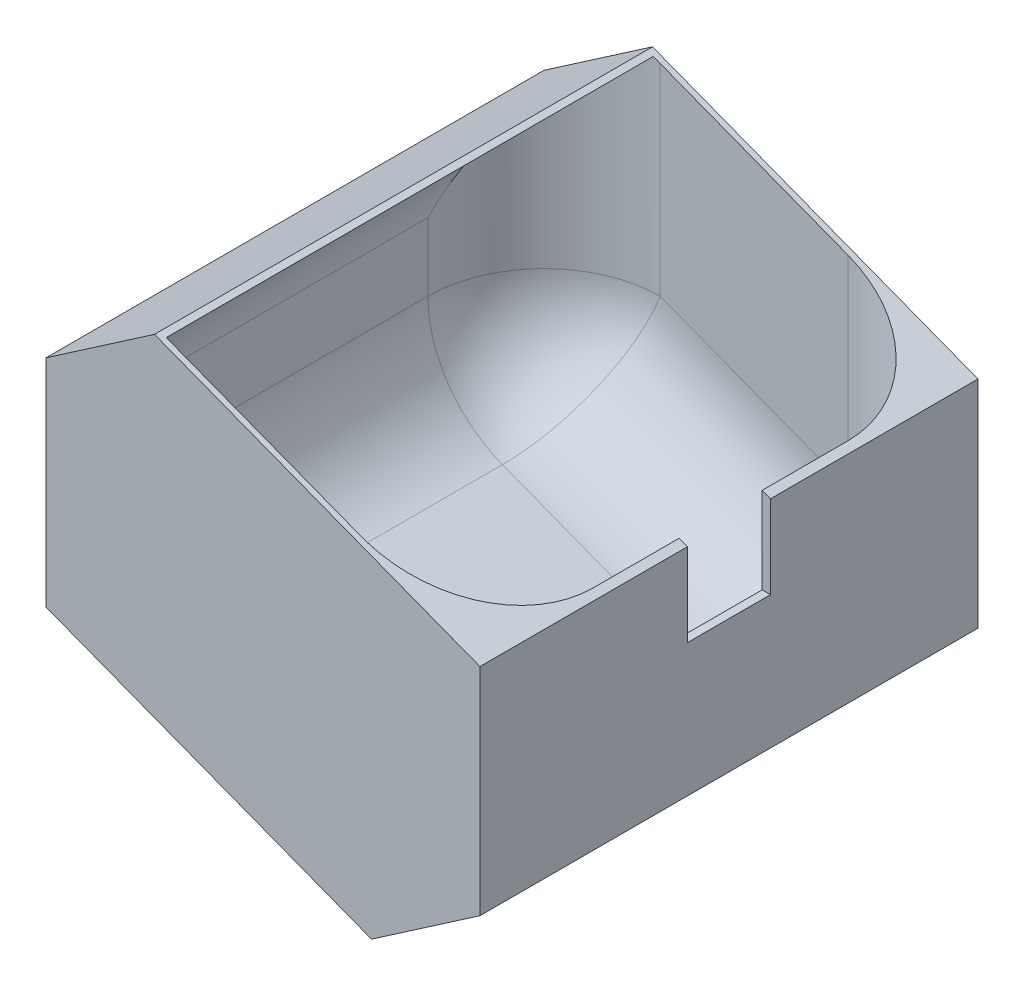
ISO-10303-21;
HEADER;
FILE_DESCRIPTION(('STEP AP214'),'2;1');
FILE_NAME('part.step','',(''),(''),'','','');
FILE_SCHEMA(('AUTOMOTIVE_DESIGN { 1 0 10303 214 1 1 1 1 }'));
ENDSEC;
DATA;
#1=APPLICATION_CONTEXT('core data for automotive mechanical design processes');
#2=APPLICATION_PROTOCOL_DEFINITION('international standard','automotive_design',2000,#1);
#3=PRODUCT_CONTEXT('',#1,'mechanical');
#4=PRODUCT('Part','Part','',(#3));
#5=PRODUCT_RELATED_PRODUCT_CATEGORY('part','',(#4));
#6=PRODUCT_DEFINITION_FORMATION('','',#4);
#7=PRODUCT_DEFINITION_CONTEXT('part definition',#1,'design');
#8=PRODUCT_DEFINITION('design','',#6,#7);
#9=PRODUCT_DEFINITION_SHAPE('','',#8);
#10=(LENGTH_UNIT() NAMED_UNIT(*) SI_UNIT(.MILLI.,.METRE.));
#11=(NAMED_UNIT(*) PLANE_ANGLE_UNIT() SI_UNIT($,.RADIAN.));
#12=(NAMED_UNIT(*) SI_UNIT($,.STERADIAN.) SOLID_ANGLE_UNIT());
#13=UNCERTAINTY_MEASURE_WITH_UNIT(LENGTH_MEASURE(1.E-05),#10,'distance_accuracy_value','');
#14=(GEOMETRIC_REPRESENTATION_CONTEXT(3) GLOBAL_UNCERTAINTY_ASSIGNED_CONTEXT((#13)) GLOBAL_UNIT_ASSIGNED_CONTEXT((#10,
#11,#12)) REPRESENTATION_CONTEXT('',''));
#15=CARTESIAN_POINT('',(0.,0.,0.));
#16=DIRECTION('',(0.,0.,1.));
#17=DIRECTION('',(1.,0.,0.));
#18=AXIS2_PLACEMENT_3D('',#15,#16,#17);
#19=CARTESIAN_POINT('',(33.1981199662404,-0.0871285716620917,38.1));
#20=DIRECTION('',(-0.358367949545305,-0.9335804264972,0.));
#21=DIRECTION('',(0.9335804264972,-0.358367949545305,0.));
#22=AXIS2_PLACEMENT_3D('',#19,#20,#21);
#23=PLANE('',#22);
#24=DIRECTION('',(0.,0.,-1.));
#25=VECTOR('',#24,1.);
#26=CARTESIAN_POINT('',(31.9281199662404,0.400378752832894,38.1));
#27=LINE('',#26,#25);
#28=CARTESIAN_POINT('',(31.9281199662404,0.400378752832893,-6.35));
#29=VERTEX_POINT('',#28);
#30=CARTESIAN_POINT('',(31.9281199662404,0.400378752832894,-19.47333418));
#31=VERTEX_POINT('',#30);
#32=EDGE_CURVE('E253',#29,#31,#27,.T.);
#33=ORIENTED_EDGE('',*,*,#32,.F.);
#34=DIRECTION('',(0.9335804264972,-0.358367949545305,0.));
#35=VECTOR('',#34,1.);
#36=CARTESIAN_POINT('',(33.1981199662404,-0.0871285716620917,-6.35));
#37=LINE('',#36,#35);
#38=CARTESIAN_POINT('',(33.1981199662404,-0.087128571662095,-6.35));
#39=VERTEX_POINT('',#38);
#40=EDGE_CURVE('E244',#29,#39,#37,.T.);
#41=ORIENTED_EDGE('',*,*,#40,.T.);
#42=DIRECTION('',(0.,0.,-1.));
#43=VECTOR('',#42,1.);
#44=CARTESIAN_POINT('',(33.1981199662404,-0.0871285716620917,38.1));
#45=LINE('',#44,#43);
#46=CARTESIAN_POINT('',(33.1981199662404,-0.0871285716620917,-38.1));
#47=VERTEX_POINT('',#46);
#48=EDGE_CURVE('E311',#39,#47,#45,.T.);
#49=ORIENTED_EDGE('',*,*,#48,.T.);
#50=DIRECTION('',(-0.9335804264972,0.358367949545305,0.));
#51=VECTOR('',#50,1.);
#52=CARTESIAN_POINT('',(33.1981199662404,-0.0871285716620917,-38.1));
#53=LINE('',#52,#51);
#54=CARTESIAN_POINT('',(-16.5990599831202,19.0282178570845,-38.1));
#55=VERTEX_POINT('',#54);
#56=EDGE_CURVE('E281',#47,#55,#53,.T.);
#57=ORIENTED_EDGE('',*,*,#56,.T.);
#58=DIRECTION('',(0.,0.,1.));
#59=VECTOR('',#58,1.);
#60=CARTESIAN_POINT('',(-16.5990599831202,19.0282178570845,-38.1));
#61=LINE('',#60,#59);
#62=CARTESIAN_POINT('',(-16.5990599831202,19.0282178570845,38.1));
#63=VERTEX_POINT('',#62);
#64=EDGE_CURVE('E284',#55,#63,#61,.T.);
#65=ORIENTED_EDGE('',*,*,#64,.T.);
#66=DIRECTION('',(-0.9335804264972,0.358367949545305,0.));
#67=VECTOR('',#66,1.);
#68=CARTESIAN_POINT('',(33.1981199662404,-0.0871285716620917,38.1));
#69=LINE('',#68,#67);
#70=CARTESIAN_POINT('',(33.1981199662404,-0.0871285716620917,38.1));
#71=VERTEX_POINT('',#70);
#72=EDGE_CURVE('E296',#71,#63,#69,.T.);
#73=ORIENTED_EDGE('',*,*,#72,.F.);
#74=CARTESIAN_POINT('',(33.1981199662404,-0.087128571662095,6.35));
#75=VERTEX_POINT('',#74);
#76=EDGE_CURVE('E325',#71,#75,#45,.T.);
#77=ORIENTED_EDGE('',*,*,#76,.T.);
#78=DIRECTION('',(-0.9335804264972,0.358367949545305,0.));
#79=VECTOR('',#78,1.);
#80=CARTESIAN_POINT('',(33.1981199662404,-0.0871285716620917,6.35));
#81=LINE('',#80,#79);
#82=CARTESIAN_POINT('',(31.9281199662404,0.400378752832893,6.35));
#83=VERTEX_POINT('',#82);
#84=EDGE_CURVE('E227',#75,#83,#81,.T.);
#85=ORIENTED_EDGE('',*,*,#84,.T.);
#86=CARTESIAN_POINT('',(31.9281199662404,0.400378752832894,19.47333418));
#87=VERTEX_POINT('',#86);
#88=EDGE_CURVE('E255',#87,#83,#27,.T.);
#89=ORIENTED_EDGE('',*,*,#88,.F.);
#90=CARTESIAN_POINT('',(14.1481199662404,7.22548129576269,19.47333418));
#91=DIRECTION('',(-0.358367949545305,-0.9335804264972,0.));
#92=DIRECTION('',(-0.9335804264972,0.358367949545305,0.));
#93=AXIS2_PLACEMENT_3D('',#90,#91,#92);
#94=ELLIPSE('',#93,19.0449579868664,17.78);
#95=CARTESIAN_POINT('',(14.1481199662404,7.22548129576269,37.25333418));
#96=VERTEX_POINT('',#95);
#97=EDGE_CURVE('E420',#87,#96,#94,.T.);
#98=ORIENTED_EDGE('',*,*,#97,.T.);
#99=DIRECTION('',(-0.9335804264972,0.358367949545305,0.));
#100=VECTOR('',#99,1.);
#101=CARTESIAN_POINT('',(33.1981199662404,-0.0871285716620917,37.25333418));
#102=LINE('',#101,#100);
#103=CARTESIAN_POINT('',(-14.5714541462404,18.2498928990784,37.25333418));
#104=VERTEX_POINT('',#103);
#105=EDGE_CURVE('E249',#96,#104,#102,.T.);
#106=ORIENTED_EDGE('',*,*,#105,.T.);
#107=CARTESIAN_POINT('',(-14.5714541462404,18.2498928990784,19.47333418));
#108=DIRECTION('',(-0.358367949545305,-0.9335804264972,0.));
#109=DIRECTION('',(0.9335804264972,-0.358367949545305,0.));
#110=AXIS2_PLACEMENT_3D('',#107,#108,#109);
#111=ELLIPSE('',#110,19.0449579868664,17.78);
#112=CARTESIAN_POINT('',(-15.6399463810421,18.6600486397334,37.2211995261245));
#113=VERTEX_POINT('',#112);
#114=EDGE_CURVE('E417',#104,#113,#111,.T.);
#115=ORIENTED_EDGE('',*,*,#114,.T.);
#116=DIRECTION('',(0.,0.,1.));
#117=VECTOR('',#116,1.);
#118=CARTESIAN_POINT('',(-15.6399463810421,18.6600486397334,38.1));
#119=LINE('',#118,#117);
#120=CARTESIAN_POINT('',(-15.6399463810421,18.6600486397334,-37.2211995261246));
#121=VERTEX_POINT('',#120);
#122=EDGE_CURVE('E263',#121,#113,#119,.T.);
#123=ORIENTED_EDGE('',*,*,#122,.F.);
#124=CARTESIAN_POINT('',(-14.5714541462404,18.2498928990784,-19.47333418));
#125=DIRECTION('',(-0.358367949545305,-0.9335804264972,0.));
#126=DIRECTION('',(-0.9335804264972,0.358367949545305,0.));
#127=AXIS2_PLACEMENT_3D('',#124,#125,#126);
#128=ELLIPSE('',#127,19.0449579868664,17.78);
#129=CARTESIAN_POINT('',(-14.5714541462404,18.2498928990784,-37.25333418));
#130=VERTEX_POINT('',#129);
#131=EDGE_CURVE('E423',#121,#130,#128,.T.);
#132=ORIENTED_EDGE('',*,*,#131,.T.);
#133=DIRECTION('',(-0.9335804264972,0.358367949545305,0.));
#134=VECTOR('',#133,1.);
#135=CARTESIAN_POINT('',(33.1981199662404,-0.0871285716620917,-37.25333418));
#136=LINE('',#135,#134);
#137=CARTESIAN_POINT('',(14.1481199662404,7.22548129576269,-37.25333418));
#138=VERTEX_POINT('',#137);
#139=EDGE_CURVE('E254',#138,#130,#136,.T.);
#140=ORIENTED_EDGE('',*,*,#139,.F.);
#141=CARTESIAN_POINT('',(14.1481199662404,7.22548129576269,-19.47333418));
#142=DIRECTION('',(-0.358367949545305,-0.9335804264972,0.));
#143=DIRECTION('',(0.9335804264972,-0.358367949545305,0.));
#144=AXIS2_PLACEMENT_3D('',#141,#142,#143);
#145=ELLIPSE('',#144,19.0449579868664,17.78);
#146=EDGE_CURVE('E413',#138,#31,#145,.T.);
#147=ORIENTED_EDGE('',*,*,#146,.T.);
#148=EDGE_LOOP('',(#33,#41,#49,#57,#65,#73,#77,#85,#89,#98,#106,#115,#123,#132,#140,#147));
#149=FACE_BOUND('',#148,.T.);
#150=ADVANCED_FACE('F47',(#149),#23,.F.);
#151=CARTESIAN_POINT('',(-33.1981199662404,25.4,38.1));
#152=DIRECTION('',(1.,0.,0.));
#153=DIRECTION('',(0.,1.,0.));
#154=AXIS2_PLACEMENT_3D('',#151,#152,#153);
#155=PLANE('',#154);
#156=DIRECTION('',(0.,-1.,0.));
#157=VECTOR('',#156,1.);
#158=CARTESIAN_POINT('',(-33.1981199662404,25.4,38.1));
#159=LINE('',#158,#157);
#160=CARTESIAN_POINT('',(-33.1981199662404,7.62,38.1));
#161=VERTEX_POINT('',#160);
#162=CARTESIAN_POINT('',(-33.1981199662404,-25.4,38.1));
#163=VERTEX_POINT('',#162);
#164=EDGE_CURVE('E300',#161,#163,#159,.T.);
#165=ORIENTED_EDGE('',*,*,#164,.F.);
#166=DIRECTION('',(0.,0.,1.));
#167=VECTOR('',#166,1.);
#168=CARTESIAN_POINT('',(-33.1981199662404,7.62,-38.1));
#169=LINE('',#168,#167);
#170=CARTESIAN_POINT('',(-33.1981199662404,7.62,-38.1));
#171=VERTEX_POINT('',#170);
#172=EDGE_CURVE('E259',#171,#161,#169,.T.);
#173=ORIENTED_EDGE('',*,*,#172,.F.);
#174=DIRECTION('',(0.,-1.,0.));
#175=VECTOR('',#174,1.);
#176=CARTESIAN_POINT('',(-33.1981199662404,25.4,-38.1));
#177=LINE('',#176,#175);
#178=CARTESIAN_POINT('',(-33.1981199662404,-25.4,-38.1));
#179=VERTEX_POINT('',#178);
#180=EDGE_CURVE('E315',#171,#179,#177,.T.);
#181=ORIENTED_EDGE('',*,*,#180,.T.);
#182=DIRECTION('',(0.,0.,-1.));
#183=VECTOR('',#182,1.);
#184=CARTESIAN_POINT('',(-33.1981199662404,-25.4,38.1));
#185=LINE('',#184,#183);
#186=EDGE_CURVE('E328',#163,#179,#185,.T.);
#187=ORIENTED_EDGE('',*,*,#186,.F.);
#188=EDGE_LOOP('',(#165,#173,#181,#187));
#189=FACE_BOUND('',#188,.T.);
#190=ADVANCED_FACE('F577',(#189),#155,.F.);
#191=CARTESIAN_POINT('',(-33.1981199662404,-25.4,38.1));
#192=DIRECTION('',(0.358367949545305,0.9335804264972,0.));
#193=DIRECTION('',(-0.9335804264972,0.358367949545305,0.));
#194=AXIS2_PLACEMENT_3D('',#191,#192,#193);
#195=PLANE('',#194);
#196=DIRECTION('',(0.9335804264972,-0.358367949545305,0.));
#197=VECTOR('',#196,1.);
#198=CARTESIAN_POINT('',(-33.1981199662404,-25.4,-38.1));
#199=LINE('',#198,#197);
#200=CARTESIAN_POINT('',(16.5990599831202,-44.5153464287465,-38.1));
#201=VERTEX_POINT('',#200);
#202=EDGE_CURVE('E318',#179,#201,#199,.T.);
#203=ORIENTED_EDGE('',*,*,#202,.T.);
#204=DIRECTION('',(0.,0.,1.));
#205=VECTOR('',#204,1.);
#206=CARTESIAN_POINT('',(16.5990599831202,-44.5153464287465,-38.1));
#207=LINE('',#206,#205);
#208=CARTESIAN_POINT('',(16.5990599831202,-44.5153464287465,38.1));
#209=VERTEX_POINT('',#208);
#210=EDGE_CURVE('E277',#201,#209,#207,.T.);
#211=ORIENTED_EDGE('',*,*,#210,.T.);
#212=DIRECTION('',(0.9335804264972,-0.358367949545305,0.));
#213=VECTOR('',#212,1.);
#214=CARTESIAN_POINT('',(-33.1981199662404,-25.4,38.1));
#215=LINE('',#214,#213);
#216=EDGE_CURVE('E304',#163,#209,#215,.T.);
#217=ORIENTED_EDGE('',*,*,#216,.F.);
#218=ORIENTED_EDGE('',*,*,#186,.T.);
#219=EDGE_LOOP('',(#203,#211,#217,#218));
#220=FACE_BOUND('',#219,.T.);
#221=ADVANCED_FACE('F584',(#220),#195,.F.);
#222=CARTESIAN_POINT('',(33.1981199662404,-50.8871285716621,38.1));
#223=DIRECTION('',(-1.,0.,0.));
#224=DIRECTION('',(0.,-1.,0.));
#225=AXIS2_PLACEMENT_3D('',#222,#223,#224);
#226=PLANE('',#225);
#227=ORIENTED_EDGE('',*,*,#48,.F.);
#228=DIRECTION('',(0.,1.,0.));
#229=VECTOR('',#228,1.);
#230=CARTESIAN_POINT('',(33.1981199662404,-12.7871285716621,-6.35));
#231=LINE('',#230,#229);
#232=CARTESIAN_POINT('',(33.1981199662404,-12.7871285716621,-6.35));
#233=VERTEX_POINT('',#232);
#234=EDGE_CURVE('E232',#233,#39,#231,.T.);
#235=ORIENTED_EDGE('',*,*,#234,.F.);
#236=DIRECTION('',(0.,0.,-1.));
#237=VECTOR('',#236,1.);
#238=CARTESIAN_POINT('',(33.1981199662404,-12.7871285716621,6.35));
#239=LINE('',#238,#237);
#240=CARTESIAN_POINT('',(33.1981199662404,-12.7871285716621,6.35));
#241=VERTEX_POINT('',#240);
#242=EDGE_CURVE('E216',#241,#233,#239,.T.);
#243=ORIENTED_EDGE('',*,*,#242,.F.);
#244=DIRECTION('',(0.,-1.,0.));
#245=VECTOR('',#244,1.);
#246=CARTESIAN_POINT('',(33.1981199662404,-12.7871285716621,6.35));
#247=LINE('',#246,#245);
#248=EDGE_CURVE('E224',#75,#241,#247,.T.);
#249=ORIENTED_EDGE('',*,*,#248,.F.);
#250=ORIENTED_EDGE('',*,*,#76,.F.);
#251=DIRECTION('',(0.,1.,0.));
#252=VECTOR('',#251,1.);
#253=CARTESIAN_POINT('',(33.1981199662404,-50.8871285716621,38.1));
#254=LINE('',#253,#252);
#255=CARTESIAN_POINT('',(33.1981199662404,-33.1071285716621,38.1));
#256=VERTEX_POINT('',#255);
#257=EDGE_CURVE('E308',#256,#71,#254,.T.);
#258=ORIENTED_EDGE('',*,*,#257,.F.);
#259=DIRECTION('',(0.,0.,1.));
#260=VECTOR('',#259,1.);
#261=CARTESIAN_POINT('',(33.1981199662404,-33.1071285716621,-38.1));
#262=LINE('',#261,#260);
#263=CARTESIAN_POINT('',(33.1981199662404,-33.1071285716621,-38.1));
#264=VERTEX_POINT('',#263);
#265=EDGE_CURVE('E272',#264,#256,#262,.T.);
#266=ORIENTED_EDGE('',*,*,#265,.F.);
#267=DIRECTION('',(0.,1.,0.));
#268=VECTOR('',#267,1.);
#269=CARTESIAN_POINT('',(33.1981199662404,-50.8871285716621,-38.1));
#270=LINE('',#269,#268);
#271=EDGE_CURVE('E301',#264,#47,#270,.T.);
#272=ORIENTED_EDGE('',*,*,#271,.T.);
#273=EDGE_LOOP('',(#227,#235,#243,#249,#250,#258,#266,#272));
#274=FACE_BOUND('',#273,.T.);
#275=ADVANCED_FACE('F235',(#274),#226,.F.);
#276=CARTESIAN_POINT('',(0.,0.,38.1));
#277=DIRECTION('',(0.,0.,1.));
#278=DIRECTION('',(1.,0.,0.));
#279=AXIS2_PLACEMENT_3D('',#276,#277,#278);
#280=PLANE('',#279);
#281=DIRECTION('',(-0.824126188622017,-0.566406236924831,0.));
#282=VECTOR('',#281,1.);
#283=CARTESIAN_POINT('',(16.5990599831202,-44.5153464287465,38.1));
#284=LINE('',#283,#282);
#285=EDGE_CURVE('E273',#256,#209,#284,.T.);
#286=ORIENTED_EDGE('',*,*,#285,.F.);
#287=ORIENTED_EDGE('',*,*,#257,.T.);
#288=ORIENTED_EDGE('',*,*,#72,.T.);
#289=DIRECTION('',(0.824126188622017,0.566406236924831,0.));
#290=VECTOR('',#289,1.);
#291=CARTESIAN_POINT('',(-16.5990599831202,19.0282178570845,38.1));
#292=LINE('',#291,#290);
#293=EDGE_CURVE('E276',#161,#63,#292,.T.);
#294=ORIENTED_EDGE('',*,*,#293,.F.);
#295=ORIENTED_EDGE('',*,*,#164,.T.);
#296=ORIENTED_EDGE('',*,*,#216,.T.);
#297=EDGE_LOOP('',(#286,#287,#288,#294,#295,#296));
#298=FACE_BOUND('',#297,.T.);
#299=ADVANCED_FACE('F630',(#298),#280,.T.);
#300=CARTESIAN_POINT('',(0.,0.,-38.1));
#301=DIRECTION('',(0.,0.,1.));
#302=DIRECTION('',(1.,0.,0.));
#303=AXIS2_PLACEMENT_3D('',#300,#301,#302);
#304=PLANE('',#303);
#305=ORIENTED_EDGE('',*,*,#271,.F.);
#306=DIRECTION('',(-0.824126188622017,-0.566406236924831,0.));
#307=VECTOR('',#306,1.);
#308=CARTESIAN_POINT('',(16.5990599831202,-44.5153464287465,-38.1));
#309=LINE('',#308,#307);
#310=EDGE_CURVE('E268',#264,#201,#309,.T.);
#311=ORIENTED_EDGE('',*,*,#310,.T.);
#312=ORIENTED_EDGE('',*,*,#202,.F.);
#313=ORIENTED_EDGE('',*,*,#180,.F.);
#314=DIRECTION('',(0.824126188622017,0.566406236924831,0.));
#315=VECTOR('',#314,1.);
#316=CARTESIAN_POINT('',(-16.5990599831202,19.0282178570845,-38.1));
#317=LINE('',#316,#315);
#318=EDGE_CURVE('E288',#171,#55,#317,.T.);
#319=ORIENTED_EDGE('',*,*,#318,.T.);
#320=ORIENTED_EDGE('',*,*,#56,.F.);
#321=EDGE_LOOP('',(#305,#311,#312,#313,#319,#320));
#322=FACE_BOUND('',#321,.T.);
#323=ADVANCED_FACE('F628',(#322),#304,.F.);
#324=CARTESIAN_POINT('',(-16.5990599831202,19.0282178570845,-38.1));
#325=DIRECTION('',(0.566406236924831,-0.824126188622017,0.));
#326=DIRECTION('',(0.824126188622017,0.566406236924831,0.));
#327=AXIS2_PLACEMENT_3D('',#324,#325,#326);
#328=PLANE('',#327);
#329=ORIENTED_EDGE('',*,*,#293,.T.);
#330=ORIENTED_EDGE('',*,*,#64,.F.);
#331=ORIENTED_EDGE('',*,*,#318,.F.);
#332=ORIENTED_EDGE('',*,*,#172,.T.);
#333=EDGE_LOOP('',(#329,#330,#331,#332));
#334=FACE_BOUND('',#333,.T.);
#335=ADVANCED_FACE('F624',(#334),#328,.F.);
#336=CARTESIAN_POINT('',(16.5990599831202,-44.5153464287465,-38.1));
#337=DIRECTION('',(-0.566406236924831,0.824126188622017,0.));
#338=DIRECTION('',(-0.824126188622017,-0.566406236924831,0.));
#339=AXIS2_PLACEMENT_3D('',#336,#337,#338);
#340=PLANE('',#339);
#341=ORIENTED_EDGE('',*,*,#285,.T.);
#342=ORIENTED_EDGE('',*,*,#210,.F.);
#343=ORIENTED_EDGE('',*,*,#310,.F.);
#344=ORIENTED_EDGE('',*,*,#265,.T.);
#345=EDGE_LOOP('',(#341,#342,#343,#344));
#346=FACE_BOUND('',#345,.T.);
#347=ADVANCED_FACE('F574',(#346),#340,.F.);
#348=CARTESIAN_POINT('',(-32.3514541462404,25.4,38.1));
#349=DIRECTION('',(1.,0.,0.));
#350=DIRECTION('',(0.,1.,0.));
#351=AXIS2_PLACEMENT_3D('',#348,#349,#350);
#352=PLANE('',#351);
#353=DIRECTION('',(0.,-1.,0.));
#354=VECTOR('',#353,1.);
#355=CARTESIAN_POINT('',(-32.3514541462404,7.17454756318963,-19.47333418));
#356=LINE('',#355,#354);
#357=CARTESIAN_POINT('',(-32.3514541462404,-12.5982472596786,-19.47333418));
#358=VERTEX_POINT('',#357);
#359=CARTESIAN_POINT('',(-32.3514541462404,-2.17996296433876,-19.47333418));
#360=VERTEX_POINT('',#359);
#361=EDGE_CURVE('E332',#358,#360,#356,.F.);
#362=ORIENTED_EDGE('',*,*,#361,.T.);
#363=DIRECTION('',(0.,0.,1.));
#364=VECTOR('',#363,1.);
#365=CARTESIAN_POINT('',(-32.3514541462404,-2.17996296433876,37.25333418));
#366=LINE('',#365,#364);
#367=CARTESIAN_POINT('',(-32.3514541462404,-2.17996296433876,19.47333418));
#368=VERTEX_POINT('',#367);
#369=EDGE_CURVE('E341',#360,#368,#366,.T.);
#370=ORIENTED_EDGE('',*,*,#369,.T.);
#371=DIRECTION('',(0.,-1.,0.));
#372=VECTOR('',#371,1.);
#373=CARTESIAN_POINT('',(-32.3514541462404,25.4,19.47333418));
#374=LINE('',#373,#372);
#375=CARTESIAN_POINT('',(-32.3514541462404,-12.5982472596786,19.47333418));
#376=VERTEX_POINT('',#375);
#377=EDGE_CURVE('E338',#368,#376,#374,.T.);
#378=ORIENTED_EDGE('',*,*,#377,.T.);
#379=DIRECTION('',(0.,0.,-1.));
#380=VECTOR('',#379,1.);
#381=CARTESIAN_POINT('',(-32.3514541462404,-12.5982472596786,-37.25333418));
#382=LINE('',#381,#380);
#383=EDGE_CURVE('E335',#376,#358,#382,.T.);
#384=ORIENTED_EDGE('',*,*,#383,.T.);
#385=EDGE_LOOP('',(#362,#370,#378,#384));
#386=FACE_BOUND('',#385,.T.);
#387=ADVANCED_FACE('F560',(#386),#352,.T.);
#388=CARTESIAN_POINT('',(-32.8947020723769,-24.6095693626638,38.1));
#389=DIRECTION('',(0.358367949545305,0.9335804264972,0.));
#390=DIRECTION('',(-0.9335804264972,0.358367949545305,0.));
#391=AXIS2_PLACEMENT_3D('',#388,#389,#390);
#392=PLANE('',#391);
#393=DIRECTION('',(0.9335804264972,-0.358367949545305,0.));
#394=VECTOR('',#393,1.);
#395=CARTESIAN_POINT('',(-32.8947020723769,-24.6095693626638,19.47333418));
#396=LINE('',#395,#394);
#397=CARTESIAN_POINT('',(-20.9432362891559,-29.1973072427988,19.47333418));
#398=VERTEX_POINT('',#397);
#399=CARTESIAN_POINT('',(7.75342427307955,-40.2129231582603,19.47333418));
#400=VERTEX_POINT('',#399);
#401=EDGE_CURVE('E377',#398,#400,#396,.T.);
#402=ORIENTED_EDGE('',*,*,#401,.T.);
#403=DIRECTION('',(0.,0.,1.));
#404=VECTOR('',#403,1.);
#405=CARTESIAN_POINT('',(7.75342427307955,-40.2129231582603,-37.25333418));
#406=LINE('',#405,#404);
#407=CARTESIAN_POINT('',(7.75342427307955,-40.2129231582603,-19.47333418));
#408=VERTEX_POINT('',#407);
#409=EDGE_CURVE('E383',#400,#408,#406,.F.);
#410=ORIENTED_EDGE('',*,*,#409,.T.);
#411=DIRECTION('',(0.9335804264972,-0.358367949545305,0.));
#412=VECTOR('',#411,1.);
#413=CARTESIAN_POINT('',(-32.3514541462404,-24.8181027036152,-19.47333418));
#414=LINE('',#413,#412);
#415=CARTESIAN_POINT('',(-20.9432362891559,-29.1973072427988,-19.47333418));
#416=VERTEX_POINT('',#415);
#417=EDGE_CURVE('E380',#408,#416,#414,.F.);
#418=ORIENTED_EDGE('',*,*,#417,.T.);
#419=DIRECTION('',(0.,0.,-1.));
#420=VECTOR('',#419,1.);
#421=CARTESIAN_POINT('',(-20.9432362891559,-29.1973072427988,37.25333418));
#422=LINE('',#421,#420);
#423=EDGE_CURVE('E374',#416,#398,#422,.F.);
#424=ORIENTED_EDGE('',*,*,#423,.T.);
#425=EDGE_LOOP('',(#402,#410,#418,#424));
#426=FACE_BOUND('',#425,.T.);
#427=ADVANCED_FACE('F565',(#426),#392,.T.);
#428=CARTESIAN_POINT('',(31.9281199662404,-50.8871285716621,38.1));
#429=DIRECTION('',(-1.,0.,0.));
#430=DIRECTION('',(0.,-1.,0.));
#431=AXIS2_PLACEMENT_3D('',#428,#429,#430);
#432=PLANE('',#431);
#433=DIRECTION('',(0.,-1.,0.));
#434=VECTOR('',#433,1.);
#435=CARTESIAN_POINT('',(31.9281199662404,-50.8871285716621,-6.35));
#436=LINE('',#435,#434);
#437=CARTESIAN_POINT('',(31.9281199662404,-12.7871285716621,-6.35));
#438=VERTEX_POINT('',#437);
#439=EDGE_CURVE('E11',#29,#438,#436,.T.);
#440=ORIENTED_EDGE('',*,*,#439,.F.);
#441=ORIENTED_EDGE('',*,*,#32,.T.);
#442=DIRECTION('',(0.,1.,0.));
#443=VECTOR('',#442,1.);
#444=CARTESIAN_POINT('',(31.9281199662404,-32.9526256558909,-19.47333418));
#445=LINE('',#444,#443);
#446=CARTESIAN_POINT('',(31.9281199662404,-23.5981151283625,-19.47333418));
#447=VERTEX_POINT('',#446);
#448=EDGE_CURVE('E402',#31,#447,#445,.F.);
#449=ORIENTED_EDGE('',*,*,#448,.T.);
#450=DIRECTION('',(0.,0.,1.));
#451=VECTOR('',#450,1.);
#452=CARTESIAN_POINT('',(31.9281199662404,-23.5981151283625,37.25333418));
#453=LINE('',#452,#451);
#454=CARTESIAN_POINT('',(31.9281199662404,-23.5981151283625,19.47333418));
#455=VERTEX_POINT('',#454);
#456=EDGE_CURVE('E396',#447,#455,#453,.T.);
#457=ORIENTED_EDGE('',*,*,#456,.T.);
#458=DIRECTION('',(0.,1.,0.));
#459=VECTOR('',#458,1.);
#460=CARTESIAN_POINT('',(31.9281199662404,-50.8871285716621,19.47333418));
#461=LINE('',#460,#459);
#462=EDGE_CURVE('E399',#455,#87,#461,.T.);
#463=ORIENTED_EDGE('',*,*,#462,.T.);
#464=ORIENTED_EDGE('',*,*,#88,.T.);
#465=DIRECTION('',(0.,1.,0.));
#466=VECTOR('',#465,1.);
#467=CARTESIAN_POINT('',(31.9281199662404,-50.8871285716621,6.35));
#468=LINE('',#467,#466);
#469=CARTESIAN_POINT('',(31.9281199662404,-12.7871285716621,6.35));
#470=VERTEX_POINT('',#469);
#471=EDGE_CURVE('E426',#470,#83,#468,.T.);
#472=ORIENTED_EDGE('',*,*,#471,.F.);
#473=DIRECTION('',(0.,0.,1.));
#474=VECTOR('',#473,1.);
#475=CARTESIAN_POINT('',(31.9281199662404,-12.7871285716621,38.1));
#476=LINE('',#475,#474);
#477=EDGE_CURVE('E56',#438,#470,#476,.T.);
#478=ORIENTED_EDGE('',*,*,#477,.F.);
#479=EDGE_LOOP('',(#440,#441,#449,#457,#463,#464,#472,#478));
#480=FACE_BOUND('',#479,.T.);
#481=ADVANCED_FACE('F486',(#480),#432,.T.);
#482=CARTESIAN_POINT('',(0.,0.,37.25333418));
#483=DIRECTION('',(0.,0.,1.));
#484=DIRECTION('',(1.,0.,0.));
#485=AXIS2_PLACEMENT_3D('',#482,#483,#484);
#486=PLANE('',#485);
#487=DIRECTION('',(0.9335804264972,-0.358367949545305,0.));
#488=VECTOR('',#487,1.);
#489=CARTESIAN_POINT('',(-6.08631311285423,-15.8553877345988,37.25333418));
#490=LINE('',#489,#488);
#491=CARTESIAN_POINT('',(14.1481199662404,-23.6226588629943,37.25333418));
#492=VERTEX_POINT('',#491);
#493=CARTESIAN_POINT('',(-14.5714541462404,-12.5982472596786,37.25333418));
#494=VERTEX_POINT('',#493);
#495=EDGE_CURVE('E71',#492,#494,#490,.F.);
#496=ORIENTED_EDGE('',*,*,#495,.T.);
#497=DIRECTION('',(0.,-1.,0.));
#498=VECTOR('',#497,1.);
#499=CARTESIAN_POINT('',(-14.5714541462404,0.,37.25333418));
#500=LINE('',#499,#498);
#501=EDGE_CURVE('E410',#494,#104,#500,.F.);
#502=ORIENTED_EDGE('',*,*,#501,.T.);
#503=ORIENTED_EDGE('',*,*,#105,.F.);
#504=DIRECTION('',(0.,1.,0.));
#505=VECTOR('',#504,1.);
#506=CARTESIAN_POINT('',(14.1481199662404,0.,37.25333418));
#507=LINE('',#506,#505);
#508=EDGE_CURVE('E405',#96,#492,#507,.F.);
#509=ORIENTED_EDGE('',*,*,#508,.T.);
#510=EDGE_LOOP('',(#496,#502,#503,#509));
#511=FACE_BOUND('',#510,.T.);
#512=ADVANCED_FACE('F510',(#511),#486,.F.);
#513=CARTESIAN_POINT('',(0.,0.,-37.25333418));
#514=DIRECTION('',(0.,0.,1.));
#515=DIRECTION('',(1.,0.,0.));
#516=AXIS2_PLACEMENT_3D('',#513,#514,#515);
#517=PLANE('',#516);
#518=DIRECTION('',(0.9335804264972,-0.358367949545305,0.));
#519=VECTOR('',#518,1.);
#520=CARTESIAN_POINT('',(22.8583943439576,-26.9662199318904,-37.25333418));
#521=LINE('',#520,#519);
#522=CARTESIAN_POINT('',(-14.5714541462404,-12.5982472596786,-37.25333418));
#523=VERTEX_POINT('',#522);
#524=CARTESIAN_POINT('',(14.1481199662404,-23.6226588629943,-37.25333418));
#525=VERTEX_POINT('',#524);
#526=EDGE_CURVE('E390',#523,#525,#521,.T.);
#527=ORIENTED_EDGE('',*,*,#526,.T.);
#528=DIRECTION('',(0.,1.,0.));
#529=VECTOR('',#528,1.);
#530=CARTESIAN_POINT('',(14.1481199662404,0.400378752832896,-37.25333418));
#531=LINE('',#530,#529);
#532=EDGE_CURVE('E393',#525,#138,#531,.T.);
#533=ORIENTED_EDGE('',*,*,#532,.T.);
#534=ORIENTED_EDGE('',*,*,#139,.T.);
#535=DIRECTION('',(0.,-1.,0.));
#536=VECTOR('',#535,1.);
#537=CARTESIAN_POINT('',(-14.5714541462404,-24.8181027036152,-37.25333418));
#538=LINE('',#537,#536);
#539=EDGE_CURVE('E387',#130,#523,#538,.T.);
#540=ORIENTED_EDGE('',*,*,#539,.T.);
#541=EDGE_LOOP('',(#527,#533,#534,#540));
#542=FACE_BOUND('',#541,.T.);
#543=ADVANCED_FACE('F533',(#542),#517,.T.);
#544=CARTESIAN_POINT('',(-16.1195031820811,18.3304583818113,-38.1));
#545=DIRECTION('',(0.566406236924831,-0.824126188622017,0.));
#546=DIRECTION('',(0.824126188622017,0.566406236924831,0.));
#547=AXIS2_PLACEMENT_3D('',#544,#545,#546);
#548=PLANE('',#547);
#549=ORIENTED_EDGE('',*,*,#122,.T.);
#550=CARTESIAN_POINT('',(-14.5714541462404,19.3944030071263,19.47333418));
#551=DIRECTION('',(0.566406236924831,-0.824126188622017,0.));
#552=DIRECTION('',(-0.824126188622017,-0.566406236924831,0.));
#553=AXIS2_PLACEMENT_3D('',#550,#551,#552);
#554=ELLIPSE('',#553,21.574365971465,17.78);
#555=CARTESIAN_POINT('',(-24.6421570387639,12.4730006693607,34.1262978136995));
#556=VERTEX_POINT('',#555);
#557=EDGE_CURVE('E352',#113,#556,#554,.T.);
#558=ORIENTED_EDGE('',*,*,#557,.T.);
#559=DIRECTION('',(0.,0.,1.));
#560=VECTOR('',#559,1.);
#561=CARTESIAN_POINT('',(-24.6421570387639,12.4730006693607,-37.25333418));
#562=LINE('',#561,#560);
#563=CARTESIAN_POINT('',(-24.6421570387639,12.4730006693607,-34.1262978136995));
#564=VERTEX_POINT('',#563);
#565=EDGE_CURVE('E348',#556,#564,#562,.F.);
#566=ORIENTED_EDGE('',*,*,#565,.T.);
#567=CARTESIAN_POINT('',(-14.5714541462404,19.3944030071263,-19.47333418));
#568=DIRECTION('',(0.566406236924831,-0.824126188622017,0.));
#569=DIRECTION('',(0.824126188622017,0.566406236924831,0.));
#570=AXIS2_PLACEMENT_3D('',#567,#568,#569);
#571=ELLIPSE('',#570,21.574365971465,17.78);
#572=EDGE_CURVE('E345',#564,#121,#571,.T.);
#573=ORIENTED_EDGE('',*,*,#572,.T.);
#574=EDGE_LOOP('',(#549,#558,#566,#573));
#575=FACE_BOUND('',#574,.T.);
#576=ADVANCED_FACE('F521',(#575),#548,.T.);
#577=CARTESIAN_POINT('',(16.1195031820811,-43.8175869534734,-38.1));
#578=DIRECTION('',(-0.566406236924831,0.824126188622017,0.));
#579=DIRECTION('',(-0.824126188622017,-0.566406236924831,0.));
#580=AXIS2_PLACEMENT_3D('',#577,#578,#579);
#581=PLANE('',#580);
#582=CARTESIAN_POINT('',(34.2666122010421,-31.345424471074,-19.47333418));
#583=DIRECTION('',(-0.566406236924831,0.824126188622017,0.));
#584=DIRECTION('',(-0.824126188622017,-0.566406236924831,0.));
#585=AXIS2_PLACEMENT_3D('',#582,#583,#584);
#586=ELLIPSE('',#585,21.574365971465,17.78);
#587=CARTESIAN_POINT('',(24.2073660836412,-38.2589527854508,-34.1341652461284));
#588=VERTEX_POINT('',#587);
#589=CARTESIAN_POINT('',(24.1959093085186,-38.2668268088396,-34.1262978136995));
#590=VERTEX_POINT('',#589);
#591=EDGE_CURVE('E367',#588,#590,#586,.T.);
#592=ORIENTED_EDGE('',*,*,#591,.T.);
#593=DIRECTION('',(0.,0.,1.));
#594=VECTOR('',#593,1.);
#595=CARTESIAN_POINT('',(24.1959093085186,-38.2668268088396,37.25333418));
#596=LINE('',#595,#594);
#597=CARTESIAN_POINT('',(24.1959093085186,-38.2668268088396,34.1262978136995));
#598=VERTEX_POINT('',#597);
#599=EDGE_CURVE('E370',#590,#598,#596,.T.);
#600=ORIENTED_EDGE('',*,*,#599,.T.);
#601=CARTESIAN_POINT('',(34.2666122010421,-31.345424471074,19.47333418));
#602=DIRECTION('',(-0.566406236924831,0.824126188622017,0.));
#603=DIRECTION('',(0.824126188622017,0.566406236924831,0.));
#604=AXIS2_PLACEMENT_3D('',#601,#602,#603);
#605=ELLIPSE('',#604,21.574365971465,17.78);
#606=CARTESIAN_POINT('',(24.2073660836412,-38.2589527854508,34.1341652461284));
#607=VERTEX_POINT('',#606);
#608=EDGE_CURVE('E361',#598,#607,#605,.T.);
#609=ORIENTED_EDGE('',*,*,#608,.T.);
#610=CARTESIAN_POINT('',(14.1481199662404,-45.1724810998275,19.47333418));
#611=DIRECTION('',(-0.566406236924831,0.824126188622017,0.));
#612=DIRECTION('',(0.824126188622017,0.566406236924831,0.));
#613=AXIS2_PLACEMENT_3D('',#610,#611,#612);
#614=ELLIPSE('',#613,21.574365971465,17.78);
#615=CARTESIAN_POINT('',(24.2188228587639,-38.251078762062,34.1262978136995));
#616=VERTEX_POINT('',#615);
#617=EDGE_CURVE('E358',#607,#616,#614,.T.);
#618=ORIENTED_EDGE('',*,*,#617,.T.);
#619=DIRECTION('',(0.,0.,1.));
#620=VECTOR('',#619,1.);
#621=CARTESIAN_POINT('',(24.2188228587639,-38.251078762062,-37.25333418));
#622=LINE('',#621,#620);
#623=CARTESIAN_POINT('',(24.2188228587639,-38.251078762062,-34.1262978136995));
#624=VERTEX_POINT('',#623);
#625=EDGE_CURVE('E355',#616,#624,#622,.F.);
#626=ORIENTED_EDGE('',*,*,#625,.T.);
#627=CARTESIAN_POINT('',(14.1481199662404,-45.1724810998275,-19.47333418));
#628=DIRECTION('',(-0.566406236924831,0.824126188622017,0.));
#629=DIRECTION('',(-0.824126188622017,-0.566406236924831,0.));
#630=AXIS2_PLACEMENT_3D('',#627,#628,#629);
#631=ELLIPSE('',#630,21.574365971465,17.78);
#632=EDGE_CURVE('E364',#624,#588,#631,.T.);
#633=ORIENTED_EDGE('',*,*,#632,.T.);
#634=EDGE_LOOP('',(#592,#600,#609,#618,#626,#633));
#635=FACE_BOUND('',#634,.T.);
#636=ADVANCED_FACE('F546',(#635),#581,.T.);
#637=CARTESIAN_POINT('',(14.1481199662404,-23.5981151283625,38.1));
#638=DIRECTION('',(0.,0.,-1.));
#639=DIRECTION('',(-1.,0.,0.));
#640=AXIS2_PLACEMENT_3D('',#637,#638,#639);
#641=CYLINDRICAL_SURFACE('',#640,17.78);
#642=CARTESIAN_POINT('',(14.1481199662404,-23.5981151283625,19.47333418));
#643=DIRECTION('',(0.,0.707106781186547,0.707106781186547));
#644=DIRECTION('',(0.,0.707106781186547,-0.707106781186547));
#645=AXIS2_PLACEMENT_3D('',#642,#643,#644);
#646=ELLIPSE('',#645,25.1447171389936,17.78);
#647=EDGE_CURVE('E472',#455,#616,#646,.F.);
#648=ORIENTED_EDGE('',*,*,#647,.F.);
#649=ORIENTED_EDGE('',*,*,#456,.F.);
#650=CARTESIAN_POINT('',(14.1481199662404,-23.5981151283625,-19.47333418));
#651=DIRECTION('',(0.,-0.707106781186547,0.707106781186547));
#652=DIRECTION('',(0.,-0.707106781186547,-0.707106781186547));
#653=AXIS2_PLACEMENT_3D('',#650,#651,#652);
#654=ELLIPSE('',#653,25.1447171389936,17.78);
#655=EDGE_CURVE('E267',#624,#447,#654,.T.);
#656=ORIENTED_EDGE('',*,*,#655,.F.);
#657=ORIENTED_EDGE('',*,*,#625,.F.);
#658=EDGE_LOOP('',(#648,#649,#656,#657));
#659=FACE_BOUND('',#658,.T.);
#660=ADVANCED_FACE('F49',(#659),#641,.F.);
#661=CARTESIAN_POINT('',(14.1481199662404,0.,-19.47333418));
#662=DIRECTION('',(0.,-1.,0.));
#663=DIRECTION('',(1.,0.,0.));
#664=AXIS2_PLACEMENT_3D('',#661,#662,#663);
#665=CYLINDRICAL_SURFACE('',#664,17.78);
#666=ORIENTED_EDGE('',*,*,#146,.F.);
#667=ORIENTED_EDGE('',*,*,#532,.F.);
#668=CARTESIAN_POINT('',(14.1481199662404,-23.6226588629943,-19.47333418));
#669=DIRECTION('',(-0.824126188622017,-0.566406236924831,0.));
#670=DIRECTION('',(-0.566406236924831,0.824126188622017,0.));
#671=AXIS2_PLACEMENT_3D('',#668,#669,#670);
#672=ELLIPSE('',#671,31.3908972763653,17.78);
#673=EDGE_CURVE('E468',#588,#525,#672,.F.);
#674=ORIENTED_EDGE('',*,*,#673,.F.);
#675=ORIENTED_EDGE('',*,*,#632,.F.);
#676=ORIENTED_EDGE('',*,*,#655,.T.);
#677=ORIENTED_EDGE('',*,*,#448,.F.);
#678=EDGE_LOOP('',(#666,#667,#674,#675,#676,#677));
#679=FACE_BOUND('',#678,.T.);
#680=ADVANCED_FACE('F494',(#679),#665,.F.);
#681=CARTESIAN_POINT('',(14.1252064159951,-23.6138631751401,-38.1));
#682=DIRECTION('',(0.,0.,-1.));
#683=DIRECTION('',(-1.,0.,0.));
#684=AXIS2_PLACEMENT_3D('',#681,#682,#683);
#685=CYLINDRICAL_SURFACE('',#684,17.78);
#686=CARTESIAN_POINT('',(14.1252064159951,-23.6138631751401,19.47333418));
#687=DIRECTION('',(0.660141050359199,-0.253404407283404,-0.707106781186547));
#688=DIRECTION('',(-0.660141050359199,0.253404407283404,-0.707106781186547));
#689=AXIS2_PLACEMENT_3D('',#686,#687,#688);
#690=ELLIPSE('',#689,25.1447171389936,17.78);
#691=EDGE_CURVE('E460',#598,#400,#690,.T.);
#692=ORIENTED_EDGE('',*,*,#691,.F.);
#693=ORIENTED_EDGE('',*,*,#599,.F.);
#694=CARTESIAN_POINT('',(14.1252064159951,-23.6138631751401,-19.47333418));
#695=DIRECTION('',(-0.660141050359199,0.253404407283404,-0.707106781186547));
#696=DIRECTION('',(0.660141050359199,-0.253404407283404,-0.707106781186547));
#697=AXIS2_PLACEMENT_3D('',#694,#695,#696);
#698=ELLIPSE('',#697,25.1447171389936,17.78);
#699=EDGE_CURVE('E464',#408,#590,#698,.F.);
#700=ORIENTED_EDGE('',*,*,#699,.F.);
#701=ORIENTED_EDGE('',*,*,#409,.F.);
#702=EDGE_LOOP('',(#692,#693,#700,#701));
#703=FACE_BOUND('',#702,.T.);
#704=ADVANCED_FACE('F549',(#703),#685,.F.);
#705=CARTESIAN_POINT('',(14.1481199662404,-50.8871285716621,19.47333418));
#706=DIRECTION('',(0.,1.,0.));
#707=DIRECTION('',(-1.,0.,0.));
#708=AXIS2_PLACEMENT_3D('',#705,#706,#707);
#709=CYLINDRICAL_SURFACE('',#708,17.78);
#710=ORIENTED_EDGE('',*,*,#647,.T.);
#711=ORIENTED_EDGE('',*,*,#617,.F.);
#712=CARTESIAN_POINT('',(14.1481199662404,-23.6226588629943,19.47333418));
#713=DIRECTION('',(0.824126188622017,0.566406236924831,0.));
#714=DIRECTION('',(0.566406236924831,-0.824126188622017,0.));
#715=AXIS2_PLACEMENT_3D('',#712,#713,#714);
#716=ELLIPSE('',#715,31.3908972763653,17.78);
#717=EDGE_CURVE('E456',#492,#607,#716,.T.);
#718=ORIENTED_EDGE('',*,*,#717,.F.);
#719=ORIENTED_EDGE('',*,*,#508,.F.);
#720=ORIENTED_EDGE('',*,*,#97,.F.);
#721=ORIENTED_EDGE('',*,*,#462,.F.);
#722=EDGE_LOOP('',(#710,#711,#718,#719,#720,#721));
#723=FACE_BOUND('',#722,.T.);
#724=ADVANCED_FACE('F507',(#723),#709,.F.);
#725=CARTESIAN_POINT('',(-6.08631311285423,-15.8553877345988,-19.47333418));
#726=DIRECTION('',(-0.9335804264972,0.358367949545305,0.));
#727=DIRECTION('',(-0.358367949545305,-0.9335804264972,0.));
#728=AXIS2_PLACEMENT_3D('',#725,#726,#727);
#729=CYLINDRICAL_SURFACE('',#728,17.78);
#730=ORIENTED_EDGE('',*,*,#673,.T.);
#731=ORIENTED_EDGE('',*,*,#526,.F.);
#732=CARTESIAN_POINT('',(-14.5714541462404,-12.5982472596786,-19.47333418));
#733=DIRECTION('',(0.9335804264972,-0.358367949545305,0.));
#734=DIRECTION('',(0.358367949545305,0.9335804264972,0.));
#735=AXIS2_PLACEMENT_3D('',#732,#733,#734);
#736=CIRCLE('',#735,17.78);
#737=EDGE_CURVE('E452',#416,#523,#736,.T.);
#738=ORIENTED_EDGE('',*,*,#737,.F.);
#739=ORIENTED_EDGE('',*,*,#417,.F.);
#740=ORIENTED_EDGE('',*,*,#699,.T.);
#741=ORIENTED_EDGE('',*,*,#591,.F.);
#742=EDGE_LOOP('',(#730,#731,#738,#739,#740,#741));
#743=FACE_BOUND('',#742,.T.);
#744=ADVANCED_FACE('F541',(#743),#729,.F.);
#745=CARTESIAN_POINT('',(-14.5714541462404,-12.5982472596786,38.1));
#746=DIRECTION('',(0.,0.,1.));
#747=DIRECTION('',(1.,0.,0.));
#748=AXIS2_PLACEMENT_3D('',#745,#746,#747);
#749=CYLINDRICAL_SURFACE('',#748,17.78);
#750=CARTESIAN_POINT('',(-14.5714541462404,-12.5982472596786,19.47333418));
#751=DIRECTION('',(0.,0.,-1.));
#752=DIRECTION('',(-1.,0.,0.));
#753=AXIS2_PLACEMENT_3D('',#750,#751,#752);
#754=CIRCLE('',#753,17.78);
#755=EDGE_CURVE('E444',#398,#376,#754,.T.);
#756=ORIENTED_EDGE('',*,*,#755,.F.);
#757=ORIENTED_EDGE('',*,*,#423,.F.);
#758=CARTESIAN_POINT('',(-14.5714541462404,-12.5982472596786,-19.47333418));
#759=DIRECTION('',(0.,0.,1.));
#760=DIRECTION('',(1.,0.,0.));
#761=AXIS2_PLACEMENT_3D('',#758,#759,#760);
#762=CIRCLE('',#761,17.78);
#763=EDGE_CURVE('E448',#358,#416,#762,.T.);
#764=ORIENTED_EDGE('',*,*,#763,.F.);
#765=ORIENTED_EDGE('',*,*,#383,.F.);
#766=EDGE_LOOP('',(#756,#757,#764,#765));
#767=FACE_BOUND('',#766,.T.);
#768=ADVANCED_FACE('F563',(#767),#749,.F.);
#769=CARTESIAN_POINT('',(-26.5229199294614,-8.01050937954358,19.47333418));
#770=DIRECTION('',(0.9335804264972,-0.358367949545305,0.));
#771=DIRECTION('',(0.358367949545305,0.9335804264972,0.));
#772=AXIS2_PLACEMENT_3D('',#769,#770,#771);
#773=CYLINDRICAL_SURFACE('',#772,17.78);
#774=ORIENTED_EDGE('',*,*,#691,.T.);
#775=ORIENTED_EDGE('',*,*,#401,.F.);
#776=CARTESIAN_POINT('',(-14.5714541462404,-12.5982472596786,19.47333418));
#777=DIRECTION('',(0.9335804264972,-0.358367949545305,0.));
#778=DIRECTION('',(0.358367949545305,0.9335804264972,0.));
#779=AXIS2_PLACEMENT_3D('',#776,#777,#778);
#780=CIRCLE('',#779,17.78);
#781=EDGE_CURVE('E440',#494,#398,#780,.T.);
#782=ORIENTED_EDGE('',*,*,#781,.F.);
#783=ORIENTED_EDGE('',*,*,#495,.F.);
#784=ORIENTED_EDGE('',*,*,#717,.T.);
#785=ORIENTED_EDGE('',*,*,#608,.F.);
#786=EDGE_LOOP('',(#774,#775,#782,#783,#784,#785));
#787=FACE_BOUND('',#786,.T.);
#788=ADVANCED_FACE('F553',(#787),#773,.F.);
#789=CARTESIAN_POINT('',(-14.5714541462404,-12.5982472596786,-19.47333418));
#790=DIRECTION('',(0.,0.,-1.));
#791=DIRECTION('',(0.,1.,0.));
#792=AXIS2_PLACEMENT_3D('',#789,#790,#791);
#793=SPHERICAL_SURFACE('',#792,17.78);
#794=ORIENTED_EDGE('',*,*,#763,.T.);
#795=ORIENTED_EDGE('',*,*,#737,.T.);
#796=CARTESIAN_POINT('',(-14.5714541462404,-12.5982472596786,-19.47333418));
#797=DIRECTION('',(0.,1.,0.));
#798=DIRECTION('',(-1.,0.,0.));
#799=AXIS2_PLACEMENT_3D('',#796,#797,#798);
#800=CIRCLE('',#799,17.78);
#801=EDGE_CURVE('E436',#358,#523,#800,.F.);
#802=ORIENTED_EDGE('',*,*,#801,.F.);
#803=EDGE_LOOP('',(#794,#795,#802));
#804=FACE_BOUND('',#803,.T.);
#805=ADVANCED_FACE('F537',(#804),#793,.F.);
#806=CARTESIAN_POINT('',(-14.5714541462404,-12.5982472596786,19.47333418));
#807=DIRECTION('',(0.,0.,1.));
#808=DIRECTION('',(0.,-1.,0.));
#809=AXIS2_PLACEMENT_3D('',#806,#807,#808);
#810=SPHERICAL_SURFACE('',#809,17.78);
#811=ORIENTED_EDGE('',*,*,#781,.T.);
#812=ORIENTED_EDGE('',*,*,#755,.T.);
#813=CARTESIAN_POINT('',(-14.5714541462404,-12.5982472596786,19.47333418));
#814=DIRECTION('',(0.,1.,0.));
#815=DIRECTION('',(0.,0.,1.));
#816=AXIS2_PLACEMENT_3D('',#813,#814,#815);
#817=CIRCLE('',#816,17.78);
#818=EDGE_CURVE('E432',#494,#376,#817,.F.);
#819=ORIENTED_EDGE('',*,*,#818,.F.);
#820=EDGE_LOOP('',(#811,#812,#819));
#821=FACE_BOUND('',#820,.T.);
#822=ADVANCED_FACE('F557',(#821),#810,.F.);
#823=CARTESIAN_POINT('',(-14.5714541462404,0.,-19.47333418));
#824=DIRECTION('',(0.,1.,0.));
#825=DIRECTION('',(-1.,0.,0.));
#826=AXIS2_PLACEMENT_3D('',#823,#824,#825);
#827=CYLINDRICAL_SURFACE('',#826,17.78);
#828=ORIENTED_EDGE('',*,*,#131,.F.);
#829=ORIENTED_EDGE('',*,*,#572,.F.);
#830=CARTESIAN_POINT('',(-14.5714541462404,-2.17996296433876,-19.47333418));
#831=DIRECTION('',(0.,-0.707106781186547,-0.707106781186547));
#832=DIRECTION('',(0.,0.707106781186547,-0.707106781186547));
#833=AXIS2_PLACEMENT_3D('',#830,#831,#832);
#834=ELLIPSE('',#833,25.1447171389936,17.78);
#835=EDGE_CURVE('E429',#360,#564,#834,.T.);
#836=ORIENTED_EDGE('',*,*,#835,.F.);
#837=ORIENTED_EDGE('',*,*,#361,.F.);
#838=ORIENTED_EDGE('',*,*,#801,.T.);
#839=ORIENTED_EDGE('',*,*,#539,.F.);
#840=EDGE_LOOP('',(#828,#829,#836,#837,#838,#839));
#841=FACE_BOUND('',#840,.T.);
#842=ADVANCED_FACE('F530',(#841),#827,.F.);
#843=CARTESIAN_POINT('',(-14.5714541462404,25.4,19.47333418));
#844=DIRECTION('',(0.,-1.,0.));
#845=DIRECTION('',(1.,0.,0.));
#846=AXIS2_PLACEMENT_3D('',#843,#844,#845);
#847=CYLINDRICAL_SURFACE('',#846,17.78);
#848=ORIENTED_EDGE('',*,*,#818,.T.);
#849=ORIENTED_EDGE('',*,*,#377,.F.);
#850=CARTESIAN_POINT('',(-14.5714541462404,-2.17996296433876,19.47333418));
#851=DIRECTION('',(0.,0.707106781186547,-0.707106781186547));
#852=DIRECTION('',(0.,-0.707106781186547,-0.707106781186547));
#853=AXIS2_PLACEMENT_3D('',#850,#851,#852);
#854=ELLIPSE('',#853,25.1447171389936,17.78);
#855=EDGE_CURVE('E248',#556,#368,#854,.F.);
#856=ORIENTED_EDGE('',*,*,#855,.F.);
#857=ORIENTED_EDGE('',*,*,#557,.F.);
#858=ORIENTED_EDGE('',*,*,#114,.F.);
#859=ORIENTED_EDGE('',*,*,#501,.F.);
#860=EDGE_LOOP('',(#848,#849,#856,#857,#858,#859));
#861=FACE_BOUND('',#860,.T.);
#862=ADVANCED_FACE('F516',(#861),#847,.F.);
#863=CARTESIAN_POINT('',(-14.5714541462404,-2.17996296433876,38.1));
#864=DIRECTION('',(0.,0.,-1.));
#865=DIRECTION('',(-1.,0.,0.));
#866=AXIS2_PLACEMENT_3D('',#863,#864,#865);
#867=CYLINDRICAL_SURFACE('',#866,17.78);
#868=ORIENTED_EDGE('',*,*,#835,.T.);
#869=ORIENTED_EDGE('',*,*,#565,.F.);
#870=ORIENTED_EDGE('',*,*,#855,.T.);
#871=ORIENTED_EDGE('',*,*,#369,.F.);
#872=EDGE_LOOP('',(#868,#869,#870,#871));
#873=FACE_BOUND('',#872,.T.);
#874=ADVANCED_FACE('F523',(#873),#867,.F.);
#875=CARTESIAN_POINT('',(30.6581199662404,-12.7871285716621,-6.35));
#876=DIRECTION('',(0.,0.,-1.));
#877=DIRECTION('',(-1.,0.,0.));
#878=AXIS2_PLACEMENT_3D('',#875,#876,#877);
#879=PLANE('',#878);
#880=ORIENTED_EDGE('',*,*,#439,.T.);
#881=DIRECTION('',(1.,0.,0.));
#882=VECTOR('',#881,1.);
#883=CARTESIAN_POINT('',(30.6581199662404,-12.7871285716621,-6.35));
#884=LINE('',#883,#882);
#885=EDGE_CURVE('E221',#438,#233,#884,.T.);
#886=ORIENTED_EDGE('',*,*,#885,.T.);
#887=ORIENTED_EDGE('',*,*,#234,.T.);
#888=ORIENTED_EDGE('',*,*,#40,.F.);
#889=EDGE_LOOP('',(#880,#886,#887,#888));
#890=FACE_BOUND('',#889,.T.);
#891=ADVANCED_FACE('F590',(#890),#879,.F.);
#892=CARTESIAN_POINT('',(30.6581199662404,-12.7871285716621,6.35));
#893=DIRECTION('',(0.,0.,1.));
#894=DIRECTION('',(1.,0.,0.));
#895=AXIS2_PLACEMENT_3D('',#892,#893,#894);
#896=PLANE('',#895);
#897=ORIENTED_EDGE('',*,*,#248,.T.);
#898=DIRECTION('',(1.,0.,0.));
#899=VECTOR('',#898,1.);
#900=CARTESIAN_POINT('',(30.6581199662404,-12.7871285716621,6.35));
#901=LINE('',#900,#899);
#902=EDGE_CURVE('E63',#470,#241,#901,.T.);
#903=ORIENTED_EDGE('',*,*,#902,.F.);
#904=ORIENTED_EDGE('',*,*,#471,.T.);
#905=ORIENTED_EDGE('',*,*,#84,.F.);
#906=EDGE_LOOP('',(#897,#903,#904,#905));
#907=FACE_BOUND('',#906,.T.);
#908=ADVANCED_FACE('F225',(#907),#896,.F.);
#909=CARTESIAN_POINT('',(30.6581199662404,-12.7871285716621,6.35));
#910=DIRECTION('',(0.,-1.,0.));
#911=DIRECTION('',(1.,0.,0.));
#912=AXIS2_PLACEMENT_3D('',#909,#910,#911);
#913=PLANE('',#912);
#914=ORIENTED_EDGE('',*,*,#477,.T.);
#915=ORIENTED_EDGE('',*,*,#902,.T.);
#916=ORIENTED_EDGE('',*,*,#242,.T.);
#917=ORIENTED_EDGE('',*,*,#885,.F.);
#918=EDGE_LOOP('',(#914,#915,#916,#917));
#919=FACE_BOUND('',#918,.T.);
#920=ADVANCED_FACE('F213',(#919),#913,.F.);
#921=CLOSED_SHELL('',(#150,#190,#221,#275,#299,#323,#335,#347,#387,#427,#481,#512,#543,#576,
#636,#660,#680,#704,#724,#744,#768,#788,#805,#822,#842,#862,#874,#891,#908,#920));
#922=MANIFOLD_SOLID_BREP('B2',#921);
#923=ADVANCED_BREP_SHAPE_REPRESENTATION('',(#18,#922),#14);
#924=SHAPE_DEFINITION_REPRESENTATION(#9,#923);
ENDSEC;
END-ISO-10303-21;
